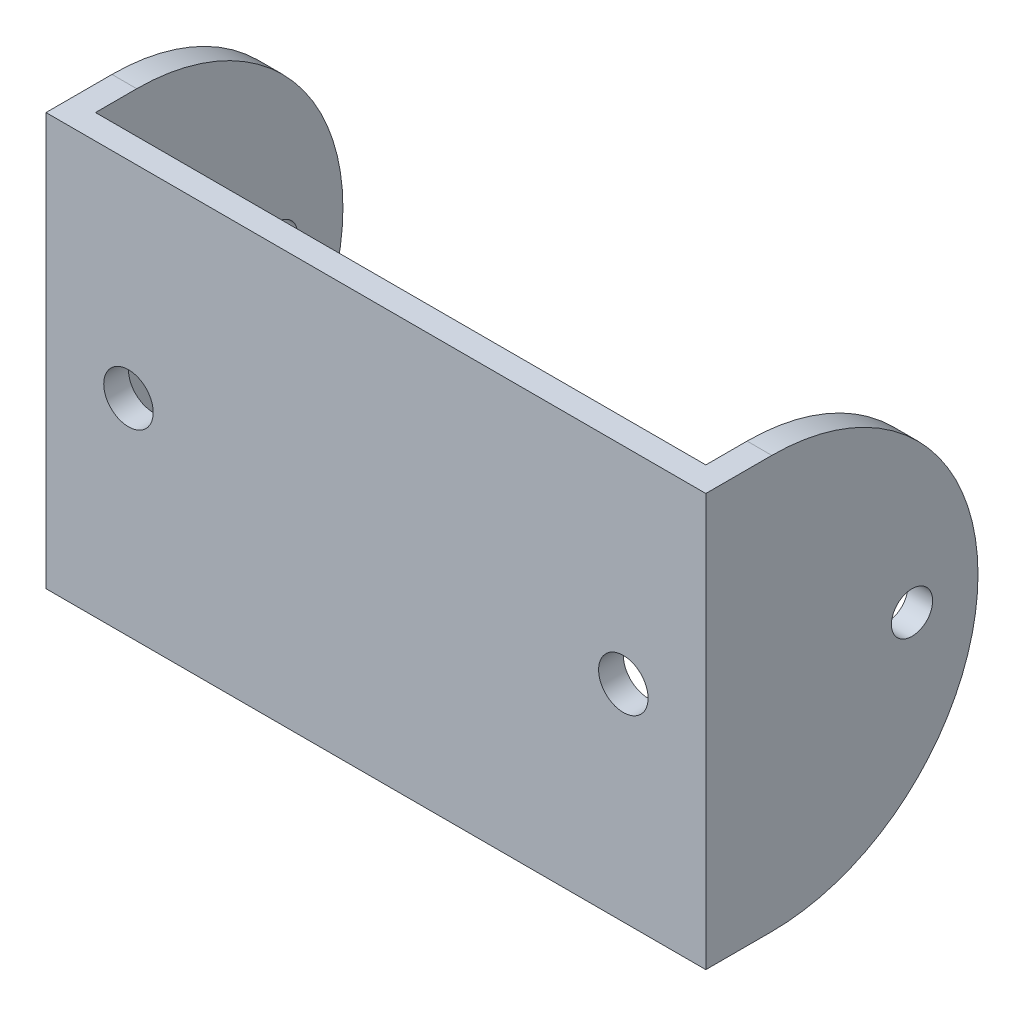
ISO-10303-21;
HEADER;
FILE_DESCRIPTION(('STEP AP214'),'2;1');
FILE_NAME('part.step','',(''),(''),'','','');
FILE_SCHEMA(('AUTOMOTIVE_DESIGN { 1 0 10303 214 1 1 1 1 }'));
ENDSEC;
DATA;
#1=APPLICATION_CONTEXT('core data for automotive mechanical design processes');
#2=APPLICATION_PROTOCOL_DEFINITION('international standard','automotive_design',2000,#1);
#3=PRODUCT_CONTEXT('',#1,'mechanical');
#4=PRODUCT('Part','Part','',(#3));
#5=PRODUCT_RELATED_PRODUCT_CATEGORY('part','',(#4));
#6=PRODUCT_DEFINITION_FORMATION('','',#4);
#7=PRODUCT_DEFINITION_CONTEXT('part definition',#1,'design');
#8=PRODUCT_DEFINITION('design','',#6,#7);
#9=PRODUCT_DEFINITION_SHAPE('','',#8);
#10=(LENGTH_UNIT() NAMED_UNIT(*) SI_UNIT(.MILLI.,.METRE.));
#11=(NAMED_UNIT(*) PLANE_ANGLE_UNIT() SI_UNIT($,.RADIAN.));
#12=(NAMED_UNIT(*) SI_UNIT($,.STERADIAN.) SOLID_ANGLE_UNIT());
#13=UNCERTAINTY_MEASURE_WITH_UNIT(LENGTH_MEASURE(1.E-05),#10,'distance_accuracy_value','');
#14=(GEOMETRIC_REPRESENTATION_CONTEXT(3) GLOBAL_UNCERTAINTY_ASSIGNED_CONTEXT((#13)) GLOBAL_UNIT_ASSIGNED_CONTEXT((#10,
#11,#12)) REPRESENTATION_CONTEXT('',''));
#15=CARTESIAN_POINT('',(0.,0.,0.));
#16=DIRECTION('',(0.,0.,1.));
#17=DIRECTION('',(1.,0.,0.));
#18=AXIS2_PLACEMENT_3D('',#15,#16,#17);
#19=CARTESIAN_POINT('',(-37.,0.,-5.));
#20=DIRECTION('',(1.,0.,0.));
#21=DIRECTION('',(0.,0.,-1.));
#22=AXIS2_PLACEMENT_3D('',#19,#20,#21);
#23=CYLINDRICAL_SURFACE('',#22,25.);
#24=DIRECTION('',(1.,0.,0.));
#25=VECTOR('',#24,1.);
#26=CARTESIAN_POINT('',(-40.,25.,-5.));
#27=LINE('',#26,#25);
#28=CARTESIAN_POINT('',(-37.,25.,-5.));
#29=VERTEX_POINT('',#28);
#30=CARTESIAN_POINT('',(-40.,25.,-5.));
#31=VERTEX_POINT('',#30);
#32=EDGE_CURVE('E176',#29,#31,#27,.F.);
#33=ORIENTED_EDGE('',*,*,#32,.F.);
#34=CARTESIAN_POINT('',(-37.,0.,-5.));
#35=DIRECTION('',(-1.,0.,0.));
#36=DIRECTION('',(0.,-1.,0.));
#37=AXIS2_PLACEMENT_3D('',#34,#35,#36);
#38=CIRCLE('',#37,25.);
#39=CARTESIAN_POINT('',(-37.,-25.,-5.));
#40=VERTEX_POINT('',#39);
#41=EDGE_CURVE('E51',#40,#29,#38,.F.);
#42=ORIENTED_EDGE('',*,*,#41,.F.);
#43=DIRECTION('',(1.,0.,0.));
#44=VECTOR('',#43,1.);
#45=CARTESIAN_POINT('',(-40.,-25.,-5.));
#46=LINE('',#45,#44);
#47=CARTESIAN_POINT('',(-40.,-25.,-5.));
#48=VERTEX_POINT('',#47);
#49=EDGE_CURVE('E179',#48,#40,#46,.T.);
#50=ORIENTED_EDGE('',*,*,#49,.F.);
#51=CARTESIAN_POINT('',(-40.,0.,-5.));
#52=DIRECTION('',(1.,0.,0.));
#53=DIRECTION('',(0.,0.,-1.));
#54=AXIS2_PLACEMENT_3D('',#51,#52,#53);
#55=CIRCLE('',#54,25.);
#56=EDGE_CURVE('E11',#31,#48,#55,.F.);
#57=ORIENTED_EDGE('',*,*,#56,.F.);
#58=EDGE_LOOP('',(#33,#42,#50,#57));
#59=FACE_BOUND('',#58,.T.);
#60=ADVANCED_FACE('F41',(#59),#23,.T.);
#61=CARTESIAN_POINT('',(40.,0.,-5.));
#62=DIRECTION('',(1.,0.,0.));
#63=DIRECTION('',(0.,0.,-1.));
#64=AXIS2_PLACEMENT_3D('',#61,#62,#63);
#65=CYLINDRICAL_SURFACE('',#64,25.);
#66=DIRECTION('',(-1.,0.,0.));
#67=VECTOR('',#66,1.);
#68=CARTESIAN_POINT('',(40.,25.,-5.));
#69=LINE('',#68,#67);
#70=CARTESIAN_POINT('',(40.,25.,-5.));
#71=VERTEX_POINT('',#70);
#72=CARTESIAN_POINT('',(37.,25.,-5.));
#73=VERTEX_POINT('',#72);
#74=EDGE_CURVE('E163',#71,#73,#69,.T.);
#75=ORIENTED_EDGE('',*,*,#74,.F.);
#76=CARTESIAN_POINT('',(40.,0.,-5.));
#77=DIRECTION('',(-1.,0.,0.));
#78=DIRECTION('',(0.,0.,1.));
#79=AXIS2_PLACEMENT_3D('',#76,#77,#78);
#80=CIRCLE('',#79,25.);
#81=CARTESIAN_POINT('',(40.,-25.,-5.));
#82=VERTEX_POINT('',#81);
#83=EDGE_CURVE('E170',#82,#71,#80,.F.);
#84=ORIENTED_EDGE('',*,*,#83,.F.);
#85=DIRECTION('',(-1.,0.,0.));
#86=VECTOR('',#85,1.);
#87=CARTESIAN_POINT('',(40.,-25.,-5.));
#88=LINE('',#87,#86);
#89=CARTESIAN_POINT('',(37.,-25.,-5.));
#90=VERTEX_POINT('',#89);
#91=EDGE_CURVE('E166',#90,#82,#88,.F.);
#92=ORIENTED_EDGE('',*,*,#91,.F.);
#93=CARTESIAN_POINT('',(37.,0.,-5.));
#94=DIRECTION('',(1.,0.,0.));
#95=DIRECTION('',(0.,1.,0.));
#96=AXIS2_PLACEMENT_3D('',#93,#94,#95);
#97=CIRCLE('',#96,25.);
#98=EDGE_CURVE('E173',#73,#90,#97,.F.);
#99=ORIENTED_EDGE('',*,*,#98,.F.);
#100=EDGE_LOOP('',(#75,#84,#92,#99));
#101=FACE_BOUND('',#100,.T.);
#102=ADVANCED_FACE('F266',(#101),#65,.T.);
#103=CARTESIAN_POINT('',(0.,0.,0.));
#104=DIRECTION('',(0.,0.,-1.));
#105=DIRECTION('',(-1.,0.,0.));
#106=AXIS2_PLACEMENT_3D('',#103,#104,#105);
#107=PLANE('',#106);
#108=CARTESIAN_POINT('',(30.,0.,0.));
#109=DIRECTION('',(0.,0.,-1.));
#110=DIRECTION('',(-1.,0.,0.));
#111=AXIS2_PLACEMENT_3D('',#108,#109,#110);
#112=CIRCLE('',#111,3.);
#113=CARTESIAN_POINT('',(27.,0.,0.));
#114=VERTEX_POINT('',#113);
#115=EDGE_CURVE('E142',#114,#114,#112,.T.);
#116=ORIENTED_EDGE('',*,*,#115,.F.);
#117=EDGE_LOOP('',(#116));
#118=FACE_BOUND('',#117,.T.);
#119=CARTESIAN_POINT('',(-30.,0.,0.));
#120=DIRECTION('',(0.,0.,-1.));
#121=DIRECTION('',(1.,0.,0.));
#122=AXIS2_PLACEMENT_3D('',#119,#120,#121);
#123=CIRCLE('',#122,3.);
#124=CARTESIAN_POINT('',(-33.,0.,0.));
#125=VERTEX_POINT('',#124);
#126=EDGE_CURVE('E200',#125,#125,#123,.T.);
#127=ORIENTED_EDGE('',*,*,#126,.F.);
#128=EDGE_LOOP('',(#127));
#129=FACE_BOUND('',#128,.T.);
#130=DIRECTION('',(1.,0.,0.));
#131=VECTOR('',#130,1.);
#132=CARTESIAN_POINT('',(-40.,-25.,0.));
#133=LINE('',#132,#131);
#134=CARTESIAN_POINT('',(-37.,-25.,0.));
#135=VERTEX_POINT('',#134);
#136=CARTESIAN_POINT('',(37.,-25.,0.));
#137=VERTEX_POINT('',#136);
#138=EDGE_CURVE('E126',#135,#137,#133,.T.);
#139=ORIENTED_EDGE('',*,*,#138,.F.);
#140=DIRECTION('',(0.,-1.,0.));
#141=VECTOR('',#140,1.);
#142=CARTESIAN_POINT('',(-37.,25.,0.));
#143=LINE('',#142,#141);
#144=CARTESIAN_POINT('',(-37.,25.,0.));
#145=VERTEX_POINT('',#144);
#146=EDGE_CURVE('E110',#145,#135,#143,.T.);
#147=ORIENTED_EDGE('',*,*,#146,.F.);
#148=DIRECTION('',(-1.,0.,0.));
#149=VECTOR('',#148,1.);
#150=CARTESIAN_POINT('',(-40.,25.,0.));
#151=LINE('',#150,#149);
#152=CARTESIAN_POINT('',(37.,25.,0.));
#153=VERTEX_POINT('',#152);
#154=EDGE_CURVE('E123',#153,#145,#151,.T.);
#155=ORIENTED_EDGE('',*,*,#154,.F.);
#156=DIRECTION('',(0.,1.,0.));
#157=VECTOR('',#156,1.);
#158=CARTESIAN_POINT('',(37.,25.,0.));
#159=LINE('',#158,#157);
#160=EDGE_CURVE('E116',#137,#153,#159,.T.);
#161=ORIENTED_EDGE('',*,*,#160,.F.);
#162=EDGE_LOOP('',(#139,#147,#155,#161));
#163=FACE_BOUND('',#162,.T.);
#164=ADVANCED_FACE('F121',(#118,#129,#163),#107,.T.);
#165=CARTESIAN_POINT('',(40.,-25.,3.));
#166=DIRECTION('',(-1.,0.,0.));
#167=DIRECTION('',(0.,0.,1.));
#168=AXIS2_PLACEMENT_3D('',#165,#166,#167);
#169=PLANE('',#168);
#170=CARTESIAN_POINT('',(40.,0.,-22.));
#171=DIRECTION('',(1.,0.,0.));
#172=DIRECTION('',(0.,0.,-1.));
#173=AXIS2_PLACEMENT_3D('',#170,#171,#172);
#174=CIRCLE('',#173,2.5);
#175=CARTESIAN_POINT('',(40.,0.,-24.5));
#176=VERTEX_POINT('',#175);
#177=EDGE_CURVE('E223',#176,#176,#174,.T.);
#178=ORIENTED_EDGE('',*,*,#177,.F.);
#179=EDGE_LOOP('',(#178));
#180=FACE_BOUND('',#179,.T.);
#181=DIRECTION('',(0.,0.,-1.));
#182=VECTOR('',#181,1.);
#183=CARTESIAN_POINT('',(40.,-25.,3.));
#184=LINE('',#183,#182);
#185=CARTESIAN_POINT('',(40.,-25.,3.));
#186=VERTEX_POINT('',#185);
#187=EDGE_CURVE('E148',#186,#82,#184,.T.);
#188=ORIENTED_EDGE('',*,*,#187,.T.);
#189=ORIENTED_EDGE('',*,*,#83,.T.);
#190=DIRECTION('',(0.,0.,-1.));
#191=VECTOR('',#190,1.);
#192=CARTESIAN_POINT('',(40.,25.,3.));
#193=LINE('',#192,#191);
#194=CARTESIAN_POINT('',(40.,25.,3.));
#195=VERTEX_POINT('',#194);
#196=EDGE_CURVE('E159',#195,#71,#193,.T.);
#197=ORIENTED_EDGE('',*,*,#196,.F.);
#198=DIRECTION('',(0.,1.,0.));
#199=VECTOR('',#198,1.);
#200=CARTESIAN_POINT('',(40.,-25.,3.));
#201=LINE('',#200,#199);
#202=EDGE_CURVE('E139',#186,#195,#201,.T.);
#203=ORIENTED_EDGE('',*,*,#202,.F.);
#204=EDGE_LOOP('',(#188,#189,#197,#203));
#205=FACE_BOUND('',#204,.T.);
#206=ADVANCED_FACE('F274',(#180,#205),#169,.F.);
#207=CARTESIAN_POINT('',(-40.,25.,3.));
#208=DIRECTION('',(0.,-1.,0.));
#209=DIRECTION('',(0.,0.,-1.));
#210=AXIS2_PLACEMENT_3D('',#207,#208,#209);
#211=PLANE('',#210);
#212=DIRECTION('',(0.,0.,1.));
#213=VECTOR('',#212,1.);
#214=CARTESIAN_POINT('',(-37.,25.,-30.));
#215=LINE('',#214,#213);
#216=EDGE_CURVE('E106',#29,#145,#215,.T.);
#217=ORIENTED_EDGE('',*,*,#216,.F.);
#218=ORIENTED_EDGE('',*,*,#32,.T.);
#219=DIRECTION('',(0.,0.,-1.));
#220=VECTOR('',#219,1.);
#221=CARTESIAN_POINT('',(-40.,25.,3.));
#222=LINE('',#221,#220);
#223=CARTESIAN_POINT('',(-40.,25.,3.));
#224=VERTEX_POINT('',#223);
#225=EDGE_CURVE('E156',#224,#31,#222,.T.);
#226=ORIENTED_EDGE('',*,*,#225,.F.);
#227=DIRECTION('',(-1.,0.,0.));
#228=VECTOR('',#227,1.);
#229=CARTESIAN_POINT('',(-40.,25.,3.));
#230=LINE('',#229,#228);
#231=EDGE_CURVE('E187',#195,#224,#230,.T.);
#232=ORIENTED_EDGE('',*,*,#231,.F.);
#233=ORIENTED_EDGE('',*,*,#196,.T.);
#234=ORIENTED_EDGE('',*,*,#74,.T.);
#235=DIRECTION('',(0.,0.,1.));
#236=VECTOR('',#235,1.);
#237=CARTESIAN_POINT('',(37.,25.,-30.));
#238=LINE('',#237,#236);
#239=EDGE_CURVE('E133',#73,#153,#238,.T.);
#240=ORIENTED_EDGE('',*,*,#239,.T.);
#241=ORIENTED_EDGE('',*,*,#154,.T.);
#242=EDGE_LOOP('',(#217,#218,#226,#232,#233,#234,#240,#241));
#243=FACE_BOUND('',#242,.T.);
#244=ADVANCED_FACE('F130',(#243),#211,.F.);
#245=CARTESIAN_POINT('',(-40.,-25.,3.));
#246=DIRECTION('',(1.,0.,0.));
#247=DIRECTION('',(0.,0.,-1.));
#248=AXIS2_PLACEMENT_3D('',#245,#246,#247);
#249=PLANE('',#248);
#250=CARTESIAN_POINT('',(-40.,0.,-22.));
#251=DIRECTION('',(1.,0.,0.));
#252=DIRECTION('',(0.,0.,-1.));
#253=AXIS2_PLACEMENT_3D('',#250,#251,#252);
#254=CIRCLE('',#253,2.5);
#255=CARTESIAN_POINT('',(-40.,0.,-24.5));
#256=VERTEX_POINT('',#255);
#257=EDGE_CURVE('E128',#256,#256,#254,.T.);
#258=ORIENTED_EDGE('',*,*,#257,.T.);
#259=EDGE_LOOP('',(#258));
#260=FACE_BOUND('',#259,.T.);
#261=ORIENTED_EDGE('',*,*,#225,.T.);
#262=ORIENTED_EDGE('',*,*,#56,.T.);
#263=DIRECTION('',(0.,0.,-1.));
#264=VECTOR('',#263,1.);
#265=CARTESIAN_POINT('',(-40.,-25.,3.));
#266=LINE('',#265,#264);
#267=CARTESIAN_POINT('',(-40.,-25.,3.));
#268=VERTEX_POINT('',#267);
#269=EDGE_CURVE('E152',#268,#48,#266,.T.);
#270=ORIENTED_EDGE('',*,*,#269,.F.);
#271=DIRECTION('',(0.,-1.,0.));
#272=VECTOR('',#271,1.);
#273=CARTESIAN_POINT('',(-40.,-25.,3.));
#274=LINE('',#273,#272);
#275=EDGE_CURVE('E185',#224,#268,#274,.T.);
#276=ORIENTED_EDGE('',*,*,#275,.F.);
#277=EDGE_LOOP('',(#261,#262,#270,#276));
#278=FACE_BOUND('',#277,.T.);
#279=ADVANCED_FACE('F240',(#260,#278),#249,.F.);
#280=CARTESIAN_POINT('',(-40.,-25.,3.));
#281=DIRECTION('',(0.,1.,0.));
#282=DIRECTION('',(0.,0.,1.));
#283=AXIS2_PLACEMENT_3D('',#280,#281,#282);
#284=PLANE('',#283);
#285=ORIENTED_EDGE('',*,*,#269,.T.);
#286=ORIENTED_EDGE('',*,*,#49,.T.);
#287=DIRECTION('',(0.,0.,1.));
#288=VECTOR('',#287,1.);
#289=CARTESIAN_POINT('',(-37.,-25.,-30.));
#290=LINE('',#289,#288);
#291=EDGE_CURVE('E117',#40,#135,#290,.T.);
#292=ORIENTED_EDGE('',*,*,#291,.T.);
#293=ORIENTED_EDGE('',*,*,#138,.T.);
#294=DIRECTION('',(0.,0.,1.));
#295=VECTOR('',#294,1.);
#296=CARTESIAN_POINT('',(37.,-25.,-30.));
#297=LINE('',#296,#295);
#298=EDGE_CURVE('E203',#90,#137,#297,.T.);
#299=ORIENTED_EDGE('',*,*,#298,.F.);
#300=ORIENTED_EDGE('',*,*,#91,.T.);
#301=ORIENTED_EDGE('',*,*,#187,.F.);
#302=DIRECTION('',(1.,0.,0.));
#303=VECTOR('',#302,1.);
#304=CARTESIAN_POINT('',(-40.,-25.,3.));
#305=LINE('',#304,#303);
#306=EDGE_CURVE('E145',#268,#186,#305,.T.);
#307=ORIENTED_EDGE('',*,*,#306,.F.);
#308=EDGE_LOOP('',(#285,#286,#292,#293,#299,#300,#301,#307));
#309=FACE_BOUND('',#308,.T.);
#310=ADVANCED_FACE('F242',(#309),#284,.F.);
#311=CARTESIAN_POINT('',(0.,0.,3.));
#312=DIRECTION('',(0.,0.,-1.));
#313=DIRECTION('',(-1.,0.,0.));
#314=AXIS2_PLACEMENT_3D('',#311,#312,#313);
#315=PLANE('',#314);
#316=CARTESIAN_POINT('',(30.,0.,3.));
#317=DIRECTION('',(0.,0.,-1.));
#318=DIRECTION('',(-1.,0.,0.));
#319=AXIS2_PLACEMENT_3D('',#316,#317,#318);
#320=CIRCLE('',#319,3.);
#321=CARTESIAN_POINT('',(27.,0.,3.));
#322=VERTEX_POINT('',#321);
#323=EDGE_CURVE('E135',#322,#322,#320,.F.);
#324=ORIENTED_EDGE('',*,*,#323,.F.);
#325=EDGE_LOOP('',(#324));
#326=FACE_BOUND('',#325,.T.);
#327=CARTESIAN_POINT('',(-30.,0.,3.));
#328=DIRECTION('',(0.,0.,-1.));
#329=DIRECTION('',(-1.,0.,0.));
#330=AXIS2_PLACEMENT_3D('',#327,#328,#329);
#331=CIRCLE('',#330,3.);
#332=CARTESIAN_POINT('',(-33.,0.,3.));
#333=VERTEX_POINT('',#332);
#334=EDGE_CURVE('E196',#333,#333,#331,.F.);
#335=ORIENTED_EDGE('',*,*,#334,.F.);
#336=EDGE_LOOP('',(#335));
#337=FACE_BOUND('',#336,.T.);
#338=ORIENTED_EDGE('',*,*,#202,.T.);
#339=ORIENTED_EDGE('',*,*,#231,.T.);
#340=ORIENTED_EDGE('',*,*,#275,.T.);
#341=ORIENTED_EDGE('',*,*,#306,.T.);
#342=EDGE_LOOP('',(#338,#339,#340,#341));
#343=FACE_BOUND('',#342,.T.);
#344=ADVANCED_FACE('F249',(#326,#337,#343),#315,.F.);
#345=CARTESIAN_POINT('',(-30.,0.,3.001));
#346=DIRECTION('',(0.,0.,-1.));
#347=DIRECTION('',(-1.,0.,0.));
#348=AXIS2_PLACEMENT_3D('',#345,#346,#347);
#349=CYLINDRICAL_SURFACE('',#348,3.);
#350=CARTESIAN_POINT('',(-33.,0.,0.));
#351=CARTESIAN_POINT('',(-33.,0.,0.0312500000000005));
#352=CARTESIAN_POINT('',(-33.,0.,0.0625000000000005));
#353=CARTESIAN_POINT('',(-33.,0.,0.125000000000001));
#354=CARTESIAN_POINT('',(-33.,0.,0.156250000000001));
#355=CARTESIAN_POINT('',(-33.,0.,0.218750000000001));
#356=CARTESIAN_POINT('',(-33.,0.,0.250000000000001));
#357=CARTESIAN_POINT('',(-33.,0.,0.312500000000001));
#358=CARTESIAN_POINT('',(-33.,0.,0.34375));
#359=CARTESIAN_POINT('',(-33.,0.,0.40625));
#360=CARTESIAN_POINT('',(-33.,0.,0.4375));
#361=CARTESIAN_POINT('',(-33.,0.,0.5));
#362=CARTESIAN_POINT('',(-33.,0.,0.53125));
#363=CARTESIAN_POINT('',(-33.,0.,0.593750000000001));
#364=CARTESIAN_POINT('',(-33.,0.,0.625000000000001));
#365=CARTESIAN_POINT('',(-33.,0.,0.687500000000001));
#366=CARTESIAN_POINT('',(-33.,0.,0.71875));
#367=CARTESIAN_POINT('',(-33.,0.,0.78125));
#368=CARTESIAN_POINT('',(-33.,0.,0.8125));
#369=CARTESIAN_POINT('',(-33.,0.,0.875));
#370=CARTESIAN_POINT('',(-33.,0.,0.90625));
#371=CARTESIAN_POINT('',(-33.,0.,0.96875));
#372=CARTESIAN_POINT('',(-33.,0.,1.));
#373=CARTESIAN_POINT('',(-33.,0.,1.0625));
#374=CARTESIAN_POINT('',(-33.,0.,1.09375));
#375=CARTESIAN_POINT('',(-33.,0.,1.15625));
#376=CARTESIAN_POINT('',(-33.,0.,1.1875));
#377=CARTESIAN_POINT('',(-33.,0.,1.25));
#378=CARTESIAN_POINT('',(-33.,0.,1.28125));
#379=CARTESIAN_POINT('',(-33.,0.,1.34375));
#380=CARTESIAN_POINT('',(-33.,0.,1.375));
#381=CARTESIAN_POINT('',(-33.,0.,1.4375));
#382=CARTESIAN_POINT('',(-33.,0.,1.46875));
#383=CARTESIAN_POINT('',(-33.,0.,1.53125));
#384=CARTESIAN_POINT('',(-33.,0.,1.5625));
#385=CARTESIAN_POINT('',(-33.,0.,1.625));
#386=CARTESIAN_POINT('',(-33.,0.,1.65625));
#387=CARTESIAN_POINT('',(-33.,0.,1.71875));
#388=CARTESIAN_POINT('',(-33.,0.,1.75));
#389=CARTESIAN_POINT('',(-33.,0.,1.8125));
#390=CARTESIAN_POINT('',(-33.,0.,1.84375));
#391=CARTESIAN_POINT('',(-33.,0.,1.90625));
#392=CARTESIAN_POINT('',(-33.,0.,1.9375));
#393=CARTESIAN_POINT('',(-33.,0.,2.));
#394=CARTESIAN_POINT('',(-33.,0.,2.03125));
#395=CARTESIAN_POINT('',(-33.,0.,2.09375));
#396=CARTESIAN_POINT('',(-33.,0.,2.125));
#397=CARTESIAN_POINT('',(-33.,0.,2.1875));
#398=CARTESIAN_POINT('',(-33.,0.,2.21875));
#399=CARTESIAN_POINT('',(-33.,0.,2.28125));
#400=CARTESIAN_POINT('',(-33.,0.,2.3125));
#401=CARTESIAN_POINT('',(-33.,0.,2.375));
#402=CARTESIAN_POINT('',(-33.,0.,2.40625));
#403=CARTESIAN_POINT('',(-33.,0.,2.46875));
#404=CARTESIAN_POINT('',(-33.,0.,2.5));
#405=CARTESIAN_POINT('',(-33.,0.,2.5625));
#406=CARTESIAN_POINT('',(-33.,0.,2.59375));
#407=CARTESIAN_POINT('',(-33.,0.,2.65625));
#408=CARTESIAN_POINT('',(-33.,0.,2.6875));
#409=CARTESIAN_POINT('',(-33.,0.,2.75));
#410=CARTESIAN_POINT('',(-33.,0.,2.78125));
#411=CARTESIAN_POINT('',(-33.,0.,2.84375));
#412=CARTESIAN_POINT('',(-33.,0.,2.875));
#413=CARTESIAN_POINT('',(-33.,0.,2.9375));
#414=CARTESIAN_POINT('',(-33.,0.,2.96875));
#415=CARTESIAN_POINT('',(-33.,0.,3.));
#416=B_SPLINE_CURVE_WITH_KNOTS('',3,(#350,#351,#352,#353,#354,#355,#356,#357,#358,#359,#360,
#361,#362,#363,#364,#365,#366,#367,#368,#369,#370,#371,#372,#373,#374,#375,#376,#377,#378,#379,
#380,#381,#382,#383,#384,#385,#386,#387,#388,#389,#390,#391,#392,#393,#394,#395,#396,#397,#398,
#399,#400,#401,#402,#403,#404,#405,#406,#407,#408,#409,#410,#411,#412,#413,#414,#415),
.UNSPECIFIED.,.F.,.F.,(4,2,2,2,2,2,2,2,2,2,2,2,2,2,2,2,2,2,2,2,2,2,2,2,2,2,2,2,2,2,2,2,4),(0.,
0.0937500000000001,0.1875,0.28125,0.375,0.46875,0.5625,0.65625,0.75,0.84375,0.9375,1.03125,
1.125,1.21875,1.3125,1.40625,1.5,1.59375,1.6875,1.78125,1.875,1.96875,2.0625,2.15625,2.25,
2.34375,2.4375,2.53125,2.625,2.71875,2.8125,2.90625,3.),.UNSPECIFIED.);
#417=EDGE_CURVE('BSEAM251',#125,#333,#416,.T.);
#418=ORIENTED_EDGE('',*,*,#126,.T.);
#419=ORIENTED_EDGE('',*,*,#334,.T.);
#420=ORIENTED_EDGE('',*,*,#417,.T.);
#421=ORIENTED_EDGE('',*,*,#417,.F.);
#422=EDGE_LOOP('',(#418,#420,#419,#421));
#423=FACE_BOUND('',#422,.T.);
#424=ADVANCED_FACE('F251',(#423),#349,.F.);
#425=CARTESIAN_POINT('',(30.,0.,3.001));
#426=DIRECTION('',(0.,0.,-1.));
#427=DIRECTION('',(-1.,0.,0.));
#428=AXIS2_PLACEMENT_3D('',#425,#426,#427);
#429=CYLINDRICAL_SURFACE('',#428,3.);
#430=CARTESIAN_POINT('',(27.,0.,0.));
#431=CARTESIAN_POINT('',(27.,0.,0.0312500000000005));
#432=CARTESIAN_POINT('',(27.,0.,0.0625000000000005));
#433=CARTESIAN_POINT('',(27.,0.,0.125000000000001));
#434=CARTESIAN_POINT('',(27.,0.,0.156250000000001));
#435=CARTESIAN_POINT('',(27.,0.,0.218750000000001));
#436=CARTESIAN_POINT('',(27.,0.,0.250000000000001));
#437=CARTESIAN_POINT('',(27.,0.,0.312500000000001));
#438=CARTESIAN_POINT('',(27.,0.,0.34375));
#439=CARTESIAN_POINT('',(27.,0.,0.40625));
#440=CARTESIAN_POINT('',(27.,0.,0.4375));
#441=CARTESIAN_POINT('',(27.,0.,0.5));
#442=CARTESIAN_POINT('',(27.,0.,0.53125));
#443=CARTESIAN_POINT('',(27.,0.,0.593750000000001));
#444=CARTESIAN_POINT('',(27.,0.,0.625000000000001));
#445=CARTESIAN_POINT('',(27.,0.,0.687500000000001));
#446=CARTESIAN_POINT('',(27.,0.,0.71875));
#447=CARTESIAN_POINT('',(27.,0.,0.78125));
#448=CARTESIAN_POINT('',(27.,0.,0.8125));
#449=CARTESIAN_POINT('',(27.,0.,0.875));
#450=CARTESIAN_POINT('',(27.,0.,0.90625));
#451=CARTESIAN_POINT('',(27.,0.,0.96875));
#452=CARTESIAN_POINT('',(27.,0.,1.));
#453=CARTESIAN_POINT('',(27.,0.,1.0625));
#454=CARTESIAN_POINT('',(27.,0.,1.09375));
#455=CARTESIAN_POINT('',(27.,0.,1.15625));
#456=CARTESIAN_POINT('',(27.,0.,1.1875));
#457=CARTESIAN_POINT('',(27.,0.,1.25));
#458=CARTESIAN_POINT('',(27.,0.,1.28125));
#459=CARTESIAN_POINT('',(27.,0.,1.34375));
#460=CARTESIAN_POINT('',(27.,0.,1.375));
#461=CARTESIAN_POINT('',(27.,0.,1.4375));
#462=CARTESIAN_POINT('',(27.,0.,1.46875));
#463=CARTESIAN_POINT('',(27.,0.,1.53125));
#464=CARTESIAN_POINT('',(27.,0.,1.5625));
#465=CARTESIAN_POINT('',(27.,0.,1.625));
#466=CARTESIAN_POINT('',(27.,0.,1.65625));
#467=CARTESIAN_POINT('',(27.,0.,1.71875));
#468=CARTESIAN_POINT('',(27.,0.,1.75));
#469=CARTESIAN_POINT('',(27.,0.,1.8125));
#470=CARTESIAN_POINT('',(27.,0.,1.84375));
#471=CARTESIAN_POINT('',(27.,0.,1.90625));
#472=CARTESIAN_POINT('',(27.,0.,1.9375));
#473=CARTESIAN_POINT('',(27.,0.,2.));
#474=CARTESIAN_POINT('',(27.,0.,2.03125));
#475=CARTESIAN_POINT('',(27.,0.,2.09375));
#476=CARTESIAN_POINT('',(27.,0.,2.125));
#477=CARTESIAN_POINT('',(27.,0.,2.1875));
#478=CARTESIAN_POINT('',(27.,0.,2.21875));
#479=CARTESIAN_POINT('',(27.,0.,2.28125));
#480=CARTESIAN_POINT('',(27.,0.,2.3125));
#481=CARTESIAN_POINT('',(27.,0.,2.375));
#482=CARTESIAN_POINT('',(27.,0.,2.40625));
#483=CARTESIAN_POINT('',(27.,0.,2.46875));
#484=CARTESIAN_POINT('',(27.,0.,2.5));
#485=CARTESIAN_POINT('',(27.,0.,2.5625));
#486=CARTESIAN_POINT('',(27.,0.,2.59375));
#487=CARTESIAN_POINT('',(27.,0.,2.65625));
#488=CARTESIAN_POINT('',(27.,0.,2.6875));
#489=CARTESIAN_POINT('',(27.,0.,2.75));
#490=CARTESIAN_POINT('',(27.,0.,2.78125));
#491=CARTESIAN_POINT('',(27.,0.,2.84375));
#492=CARTESIAN_POINT('',(27.,0.,2.875));
#493=CARTESIAN_POINT('',(27.,0.,2.9375));
#494=CARTESIAN_POINT('',(27.,0.,2.96875));
#495=CARTESIAN_POINT('',(27.,0.,3.));
#496=B_SPLINE_CURVE_WITH_KNOTS('',3,(#430,#431,#432,#433,#434,#435,#436,#437,#438,#439,#440,
#441,#442,#443,#444,#445,#446,#447,#448,#449,#450,#451,#452,#453,#454,#455,#456,#457,#458,#459,
#460,#461,#462,#463,#464,#465,#466,#467,#468,#469,#470,#471,#472,#473,#474,#475,#476,#477,#478,
#479,#480,#481,#482,#483,#484,#485,#486,#487,#488,#489,#490,#491,#492,#493,#494,#495),
.UNSPECIFIED.,.F.,.F.,(4,2,2,2,2,2,2,2,2,2,2,2,2,2,2,2,2,2,2,2,2,2,2,2,2,2,2,2,2,2,2,2,4),(0.,
0.0937500000000001,0.1875,0.28125,0.375,0.46875,0.5625,0.65625,0.75,0.84375,0.9375,1.03125,
1.125,1.21875,1.3125,1.40625,1.5,1.59375,1.6875,1.78125,1.875,1.96875,2.0625,2.15625,2.25,
2.34375,2.4375,2.53125,2.625,2.71875,2.8125,2.90625,3.),.UNSPECIFIED.);
#497=EDGE_CURVE('BSEAM258',#114,#322,#496,.T.);
#498=ORIENTED_EDGE('',*,*,#115,.T.);
#499=ORIENTED_EDGE('',*,*,#323,.T.);
#500=ORIENTED_EDGE('',*,*,#497,.T.);
#501=ORIENTED_EDGE('',*,*,#497,.F.);
#502=EDGE_LOOP('',(#498,#500,#499,#501));
#503=FACE_BOUND('',#502,.T.);
#504=ADVANCED_FACE('F258',(#503),#429,.F.);
#505=CARTESIAN_POINT('',(37.,25.,-30.));
#506=DIRECTION('',(1.,0.,0.));
#507=DIRECTION('',(0.,1.,0.));
#508=AXIS2_PLACEMENT_3D('',#505,#506,#507);
#509=PLANE('',#508);
#510=CARTESIAN_POINT('',(37.,0.,-22.));
#511=DIRECTION('',(1.,0.,0.));
#512=DIRECTION('',(0.,1.,0.));
#513=AXIS2_PLACEMENT_3D('',#510,#511,#512);
#514=CIRCLE('',#513,2.5);
#515=CARTESIAN_POINT('',(37.,2.5,-22.));
#516=VERTEX_POINT('',#515);
#517=EDGE_CURVE('E219',#516,#516,#514,.T.);
#518=ORIENTED_EDGE('',*,*,#517,.T.);
#519=EDGE_LOOP('',(#518));
#520=FACE_BOUND('',#519,.T.);
#521=ORIENTED_EDGE('',*,*,#239,.F.);
#522=ORIENTED_EDGE('',*,*,#98,.T.);
#523=ORIENTED_EDGE('',*,*,#298,.T.);
#524=ORIENTED_EDGE('',*,*,#160,.T.);
#525=EDGE_LOOP('',(#521,#522,#523,#524));
#526=FACE_BOUND('',#525,.T.);
#527=ADVANCED_FACE('F347',(#520,#526),#509,.F.);
#528=CARTESIAN_POINT('',(-37.,25.,-30.));
#529=DIRECTION('',(-1.,0.,0.));
#530=DIRECTION('',(0.,-1.,0.));
#531=AXIS2_PLACEMENT_3D('',#528,#529,#530);
#532=PLANE('',#531);
#533=CARTESIAN_POINT('',(-37.,0.,-22.));
#534=DIRECTION('',(-1.,0.,0.));
#535=DIRECTION('',(0.,-1.,0.));
#536=AXIS2_PLACEMENT_3D('',#533,#534,#535);
#537=CIRCLE('',#536,2.5);
#538=CARTESIAN_POINT('',(-37.,-2.5,-22.));
#539=VERTEX_POINT('',#538);
#540=EDGE_CURVE('E45',#539,#539,#537,.T.);
#541=ORIENTED_EDGE('',*,*,#540,.T.);
#542=EDGE_LOOP('',(#541));
#543=FACE_BOUND('',#542,.T.);
#544=ORIENTED_EDGE('',*,*,#291,.F.);
#545=ORIENTED_EDGE('',*,*,#41,.T.);
#546=ORIENTED_EDGE('',*,*,#216,.T.);
#547=ORIENTED_EDGE('',*,*,#146,.T.);
#548=EDGE_LOOP('',(#544,#545,#546,#547));
#549=FACE_BOUND('',#548,.T.);
#550=ADVANCED_FACE('F109',(#543,#549),#532,.F.);
#551=CARTESIAN_POINT('',(-160.,0.,-22.));
#552=DIRECTION('',(1.,0.,0.));
#553=DIRECTION('',(0.,0.,-1.));
#554=AXIS2_PLACEMENT_3D('',#551,#552,#553);
#555=CYLINDRICAL_SURFACE('',#554,2.5);
#556=ORIENTED_EDGE('',*,*,#540,.F.);
#557=EDGE_LOOP('',(#556));
#558=FACE_BOUND('',#557,.T.);
#559=ORIENTED_EDGE('',*,*,#257,.F.);
#560=EDGE_LOOP('',(#559));
#561=FACE_BOUND('',#560,.T.);
#562=ADVANCED_FACE('F233',(#558,#561),#555,.F.);
#563=ORIENTED_EDGE('',*,*,#177,.T.);
#564=EDGE_LOOP('',(#563));
#565=FACE_BOUND('',#564,.T.);
#566=ORIENTED_EDGE('',*,*,#517,.F.);
#567=EDGE_LOOP('',(#566));
#568=FACE_BOUND('',#567,.T.);
#569=ADVANCED_FACE('F236',(#565,#568),#555,.F.);
#570=CLOSED_SHELL('',(#60,#102,#164,#206,#244,#279,#310,#344,#424,#504,#527,#550,#562,#569));
#571=MANIFOLD_SOLID_BREP('B2',#570);
#572=ADVANCED_BREP_SHAPE_REPRESENTATION('',(#18,#571),#14);
#573=SHAPE_DEFINITION_REPRESENTATION(#9,#572);
ENDSEC;
END-ISO-10303-21;
